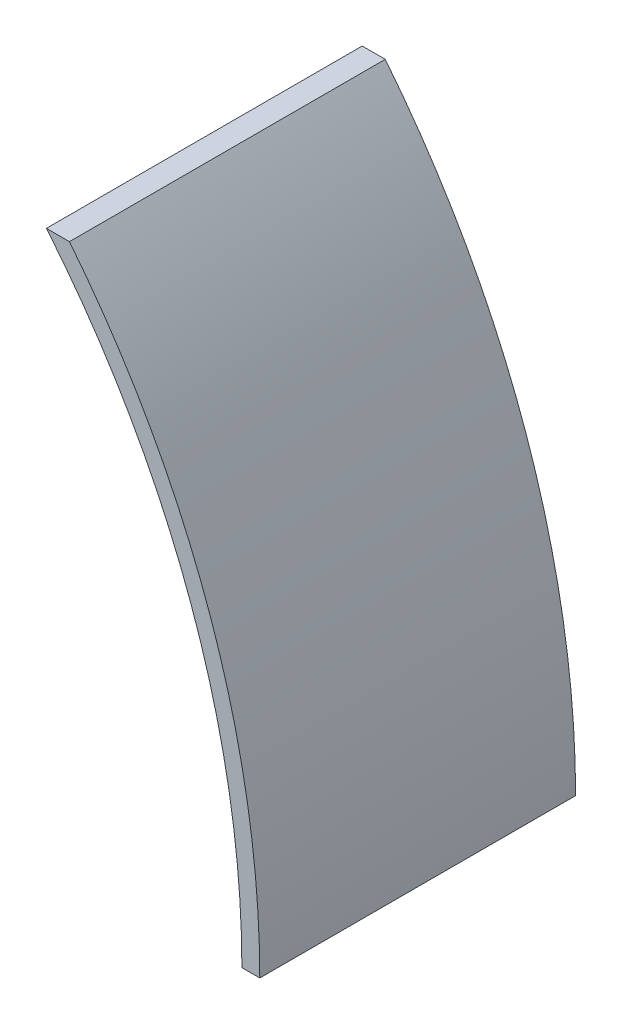
ISO-10303-21;
HEADER;
FILE_DESCRIPTION(('STEP AP214'),'2;1');
FILE_NAME('part.step','',(''),(''),'','','');
FILE_SCHEMA(('AUTOMOTIVE_DESIGN { 1 0 10303 214 1 1 1 1 }'));
ENDSEC;
DATA;
#1=APPLICATION_CONTEXT('core data for automotive mechanical design processes');
#2=APPLICATION_PROTOCOL_DEFINITION('international standard','automotive_design',2000,#1);
#3=PRODUCT_CONTEXT('',#1,'mechanical');
#4=PRODUCT('Part','Part','',(#3));
#5=PRODUCT_RELATED_PRODUCT_CATEGORY('part','',(#4));
#6=PRODUCT_DEFINITION_FORMATION('','',#4);
#7=PRODUCT_DEFINITION_CONTEXT('part definition',#1,'design');
#8=PRODUCT_DEFINITION('design','',#6,#7);
#9=PRODUCT_DEFINITION_SHAPE('','',#8);
#10=(LENGTH_UNIT() NAMED_UNIT(*) SI_UNIT(.MILLI.,.METRE.));
#11=(NAMED_UNIT(*) PLANE_ANGLE_UNIT() SI_UNIT($,.RADIAN.));
#12=(NAMED_UNIT(*) SI_UNIT($,.STERADIAN.) SOLID_ANGLE_UNIT());
#13=UNCERTAINTY_MEASURE_WITH_UNIT(LENGTH_MEASURE(1.E-05),#10,'distance_accuracy_value','');
#14=(GEOMETRIC_REPRESENTATION_CONTEXT(3) GLOBAL_UNCERTAINTY_ASSIGNED_CONTEXT((#13)) GLOBAL_UNIT_ASSIGNED_CONTEXT((#10,
#11,#12)) REPRESENTATION_CONTEXT('',''));
#15=CARTESIAN_POINT('',(0.,0.,0.));
#16=DIRECTION('',(0.,0.,1.));
#17=DIRECTION('',(1.,0.,0.));
#18=AXIS2_PLACEMENT_3D('',#15,#16,#17);
#19=CARTESIAN_POINT('',(501.586016125154,-1391.98658872241,810.26));
#20=DIRECTION('',(0.,1.,0.));
#21=DIRECTION('',(-1.,0.,0.));
#22=AXIS2_PLACEMENT_3D('',#19,#20,#21);
#23=PLANE('',#22);
#24=DIRECTION('',(1.,0.,0.));
#25=VECTOR('',#24,1.);
#26=CARTESIAN_POINT('',(501.586016125154,-1391.98658872241,0.));
#27=LINE('',#26,#25);
#28=CARTESIAN_POINT('',(501.586016125154,-1391.98658872241,0.));
#29=VERTEX_POINT('',#28);
#30=CARTESIAN_POINT('',(547.472614707192,-1391.98658872241,0.));
#31=VERTEX_POINT('',#30);
#32=EDGE_CURVE('E96',#29,#31,#27,.T.);
#33=ORIENTED_EDGE('',*,*,#32,.T.);
#34=DIRECTION('',(0.,0.,-1.));
#35=VECTOR('',#34,1.);
#36=CARTESIAN_POINT('',(547.472614707192,-1391.98658872241,810.26));
#37=LINE('',#36,#35);
#38=CARTESIAN_POINT('',(547.472614707192,-1391.98658872241,810.26));
#39=VERTEX_POINT('',#38);
#40=EDGE_CURVE('E11',#39,#31,#37,.T.);
#41=ORIENTED_EDGE('',*,*,#40,.F.);
#42=DIRECTION('',(1.,0.,0.));
#43=VECTOR('',#42,1.);
#44=CARTESIAN_POINT('',(501.586016125154,-1391.98658872241,810.26));
#45=LINE('',#44,#43);
#46=CARTESIAN_POINT('',(501.586016125154,-1391.98658872241,810.26));
#47=VERTEX_POINT('',#46);
#48=EDGE_CURVE('E82',#47,#39,#45,.T.);
#49=ORIENTED_EDGE('',*,*,#48,.F.);
#50=DIRECTION('',(0.,0.,-1.));
#51=VECTOR('',#50,1.);
#52=CARTESIAN_POINT('',(501.586016125154,-1391.98658872241,810.26));
#53=LINE('',#52,#51);
#54=EDGE_CURVE('E49',#47,#29,#53,.T.);
#55=ORIENTED_EDGE('',*,*,#54,.T.);
#56=EDGE_LOOP('',(#33,#41,#49,#55));
#57=FACE_BOUND('',#56,.T.);
#58=ADVANCED_FACE('F33',(#57),#23,.F.);
#59=CARTESIAN_POINT('',(-1685.18680169993,-1393.60087761297,810.26));
#60=DIRECTION('',(0.,0.,-1.));
#61=DIRECTION('',(-1.,0.,0.));
#62=AXIS2_PLACEMENT_3D('',#59,#60,#61);
#63=CYLINDRICAL_SURFACE('',#62,2232.66);
#64=CARTESIAN_POINT('',(-1685.18680169993,-1393.60087761297,0.));
#65=DIRECTION('',(0.,0.,1.));
#66=DIRECTION('',(1.,0.,0.));
#67=AXIS2_PLACEMENT_3D('',#64,#65,#66);
#68=CIRCLE('',#67,2232.66);
#69=CARTESIAN_POINT('',(59.1317671160916,0.,0.));
#70=VERTEX_POINT('',#69);
#71=EDGE_CURVE('E87',#31,#70,#68,.T.);
#72=ORIENTED_EDGE('',*,*,#71,.T.);
#73=DIRECTION('',(0.,0.,-1.));
#74=VECTOR('',#73,1.);
#75=CARTESIAN_POINT('',(59.1317671160916,0.,810.26));
#76=LINE('',#75,#74);
#77=CARTESIAN_POINT('',(59.1317671160916,0.,810.26));
#78=VERTEX_POINT('',#77);
#79=EDGE_CURVE('E41',#78,#70,#76,.T.);
#80=ORIENTED_EDGE('',*,*,#79,.F.);
#81=CARTESIAN_POINT('',(-1685.18680169993,-1393.60087761297,810.26));
#82=DIRECTION('',(0.,0.,1.));
#83=DIRECTION('',(1.,0.,0.));
#84=AXIS2_PLACEMENT_3D('',#81,#82,#83);
#85=CIRCLE('',#84,2232.66);
#86=EDGE_CURVE('E75',#39,#78,#85,.T.);
#87=ORIENTED_EDGE('',*,*,#86,.F.);
#88=ORIENTED_EDGE('',*,*,#40,.T.);
#89=EDGE_LOOP('',(#72,#80,#87,#88));
#90=FACE_BOUND('',#89,.T.);
#91=ADVANCED_FACE('F86',(#90),#63,.T.);
#92=CARTESIAN_POINT('',(59.1317671160916,0.,810.26));
#93=DIRECTION('',(0.,-1.,0.));
#94=DIRECTION('',(0.,0.,-1.));
#95=AXIS2_PLACEMENT_3D('',#92,#93,#94);
#96=PLANE('',#95);
#97=DIRECTION('',(-1.,0.,0.));
#98=VECTOR('',#97,1.);
#99=CARTESIAN_POINT('',(59.1317671160916,0.,0.));
#100=LINE('',#99,#98);
#101=CARTESIAN_POINT('',(0.,-2.22044604925031E-13,0.));
#102=VERTEX_POINT('',#101);
#103=EDGE_CURVE('E99',#70,#102,#100,.T.);
#104=ORIENTED_EDGE('',*,*,#103,.T.);
#105=DIRECTION('',(0.,0.,-1.));
#106=VECTOR('',#105,1.);
#107=CARTESIAN_POINT('',(0.,-2.22044604925031E-13,810.26));
#108=LINE('',#107,#106);
#109=CARTESIAN_POINT('',(0.,-2.22044604925031E-13,810.26));
#110=VERTEX_POINT('',#109);
#111=EDGE_CURVE('E64',#110,#102,#108,.T.);
#112=ORIENTED_EDGE('',*,*,#111,.F.);
#113=DIRECTION('',(-1.,0.,0.));
#114=VECTOR('',#113,1.);
#115=CARTESIAN_POINT('',(59.1317671160916,0.,810.26));
#116=LINE('',#115,#114);
#117=EDGE_CURVE('E81',#78,#110,#116,.T.);
#118=ORIENTED_EDGE('',*,*,#117,.F.);
#119=ORIENTED_EDGE('',*,*,#79,.T.);
#120=EDGE_LOOP('',(#104,#112,#118,#119));
#121=FACE_BOUND('',#120,.T.);
#122=ADVANCED_FACE('F90',(#121),#96,.F.);
#123=CARTESIAN_POINT('',(-1685.18680169993,-1393.60087761297,810.26));
#124=DIRECTION('',(0.,0.,-1.));
#125=DIRECTION('',(-1.,0.,0.));
#126=AXIS2_PLACEMENT_3D('',#123,#124,#125);
#127=CYLINDRICAL_SURFACE('',#126,2186.7734136639);
#128=CARTESIAN_POINT('',(-1685.18680169993,-1393.60087761297,0.));
#129=DIRECTION('',(0.,0.,1.));
#130=DIRECTION('',(1.,0.,0.));
#131=AXIS2_PLACEMENT_3D('',#128,#129,#130);
#132=CIRCLE('',#131,2186.7734136639);
#133=EDGE_CURVE('E101',#29,#102,#132,.T.);
#134=ORIENTED_EDGE('',*,*,#133,.F.);
#135=ORIENTED_EDGE('',*,*,#54,.F.);
#136=CARTESIAN_POINT('',(-1685.18680169993,-1393.60087761297,810.26));
#137=DIRECTION('',(0.,0.,1.));
#138=DIRECTION('',(1.,0.,0.));
#139=AXIS2_PLACEMENT_3D('',#136,#137,#138);
#140=CIRCLE('',#139,2186.7734136639);
#141=EDGE_CURVE('E91',#47,#110,#140,.T.);
#142=ORIENTED_EDGE('',*,*,#141,.T.);
#143=ORIENTED_EDGE('',*,*,#111,.T.);
#144=EDGE_LOOP('',(#134,#135,#142,#143));
#145=FACE_BOUND('',#144,.T.);
#146=ADVANCED_FACE('F107',(#145),#127,.F.);
#147=CARTESIAN_POINT('',(-1685.18680169993,-1393.60087761297,810.26));
#148=DIRECTION('',(0.,0.,1.));
#149=DIRECTION('',(1.,0.,0.));
#150=AXIS2_PLACEMENT_3D('',#147,#148,#149);
#151=PLANE('',#150);
#152=ORIENTED_EDGE('',*,*,#48,.T.);
#153=ORIENTED_EDGE('',*,*,#86,.T.);
#154=ORIENTED_EDGE('',*,*,#117,.T.);
#155=ORIENTED_EDGE('',*,*,#141,.F.);
#156=EDGE_LOOP('',(#152,#153,#154,#155));
#157=FACE_BOUND('',#156,.T.);
#158=ADVANCED_FACE('F78',(#157),#151,.T.);
#159=CARTESIAN_POINT('',(-1685.18680169993,-1393.60087761297,0.));
#160=DIRECTION('',(0.,0.,1.));
#161=DIRECTION('',(1.,0.,0.));
#162=AXIS2_PLACEMENT_3D('',#159,#160,#161);
#163=PLANE('',#162);
#164=ORIENTED_EDGE('',*,*,#32,.F.);
#165=ORIENTED_EDGE('',*,*,#133,.T.);
#166=ORIENTED_EDGE('',*,*,#103,.F.);
#167=ORIENTED_EDGE('',*,*,#71,.F.);
#168=EDGE_LOOP('',(#164,#165,#166,#167));
#169=FACE_BOUND('',#168,.T.);
#170=ADVANCED_FACE('F106',(#169),#163,.F.);
#171=CLOSED_SHELL('',(#58,#91,#122,#146,#158,#170));
#172=MANIFOLD_SOLID_BREP('B2',#171);
#173=ADVANCED_BREP_SHAPE_REPRESENTATION('',(#18,#172),#14);
#174=SHAPE_DEFINITION_REPRESENTATION(#9,#173);
ENDSEC;
END-ISO-10303-21;
